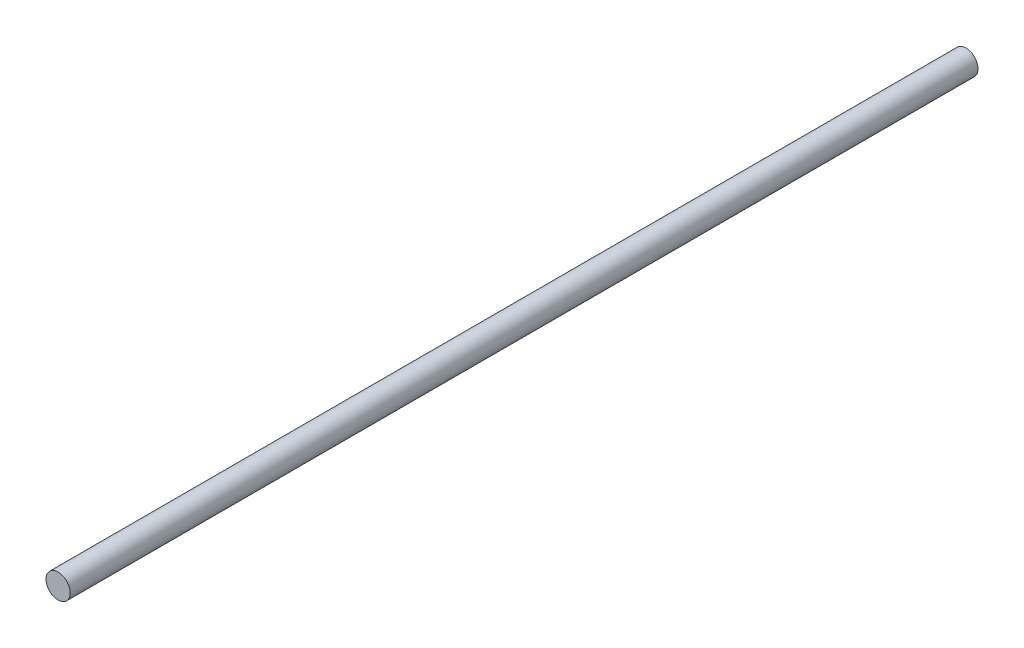
ISO-10303-21;
HEADER;
FILE_DESCRIPTION(('STEP AP214'),'2;1');
FILE_NAME('part.step','',(''),(''),'','','');
FILE_SCHEMA(('AUTOMOTIVE_DESIGN { 1 0 10303 214 1 1 1 1 }'));
ENDSEC;
DATA;
#1=APPLICATION_CONTEXT('core data for automotive mechanical design processes');
#2=APPLICATION_PROTOCOL_DEFINITION('international standard','automotive_design',2000,#1);
#3=PRODUCT_CONTEXT('',#1,'mechanical');
#4=PRODUCT('Part','Part','',(#3));
#5=PRODUCT_RELATED_PRODUCT_CATEGORY('part','',(#4));
#6=PRODUCT_DEFINITION_FORMATION('','',#4);
#7=PRODUCT_DEFINITION_CONTEXT('part definition',#1,'design');
#8=PRODUCT_DEFINITION('design','',#6,#7);
#9=PRODUCT_DEFINITION_SHAPE('','',#8);
#10=(LENGTH_UNIT() NAMED_UNIT(*) SI_UNIT(.MILLI.,.METRE.));
#11=(NAMED_UNIT(*) PLANE_ANGLE_UNIT() SI_UNIT($,.RADIAN.));
#12=(NAMED_UNIT(*) SI_UNIT($,.STERADIAN.) SOLID_ANGLE_UNIT());
#13=UNCERTAINTY_MEASURE_WITH_UNIT(LENGTH_MEASURE(1.E-05),#10,'distance_accuracy_value','');
#14=(GEOMETRIC_REPRESENTATION_CONTEXT(3) GLOBAL_UNCERTAINTY_ASSIGNED_CONTEXT((#13)) GLOBAL_UNIT_ASSIGNED_CONTEXT((#10,
#11,#12)) REPRESENTATION_CONTEXT('',''));
#15=CARTESIAN_POINT('',(0.,0.,0.));
#16=DIRECTION('',(0.,0.,1.));
#17=DIRECTION('',(1.,0.,0.));
#18=AXIS2_PLACEMENT_3D('',#15,#16,#17);
#19=CARTESIAN_POINT('',(0.,0.,600.));
#20=DIRECTION('',(0.,0.,-1.));
#21=DIRECTION('',(-1.,0.,0.));
#22=AXIS2_PLACEMENT_3D('',#19,#20,#21);
#23=CYLINDRICAL_SURFACE('',#22,8.);
#24=CARTESIAN_POINT('',(0.,0.,600.));
#25=DIRECTION('',(0.,0.,1.));
#26=DIRECTION('',(1.,0.,0.));
#27=AXIS2_PLACEMENT_3D('',#24,#25,#26);
#28=CIRCLE('',#27,8.);
#29=CARTESIAN_POINT('',(8.,0.,600.));
#30=VERTEX_POINT('',#29);
#31=EDGE_CURVE('E10',#30,#30,#28,.T.);
#32=ORIENTED_EDGE('',*,*,#31,.F.);
#33=EDGE_LOOP('',(#32));
#34=FACE_BOUND('',#33,.T.);
#35=CARTESIAN_POINT('',(0.,0.,0.));
#36=DIRECTION('',(0.,0.,1.));
#37=DIRECTION('',(1.,0.,0.));
#38=AXIS2_PLACEMENT_3D('',#35,#36,#37);
#39=CIRCLE('',#38,8.);
#40=CARTESIAN_POINT('',(8.,0.,0.));
#41=VERTEX_POINT('',#40);
#42=EDGE_CURVE('E34',#41,#41,#39,.T.);
#43=ORIENTED_EDGE('',*,*,#42,.T.);
#44=EDGE_LOOP('',(#43));
#45=FACE_BOUND('',#44,.T.);
#46=ADVANCED_FACE('F31',(#34,#45),#23,.T.);
#47=CARTESIAN_POINT('',(0.,0.,600.));
#48=DIRECTION('',(0.,0.,1.));
#49=DIRECTION('',(1.,0.,0.));
#50=AXIS2_PLACEMENT_3D('',#47,#48,#49);
#51=PLANE('',#50);
#52=ORIENTED_EDGE('',*,*,#31,.T.);
#53=EDGE_LOOP('',(#52));
#54=FACE_BOUND('',#53,.T.);
#55=ADVANCED_FACE('F46',(#54),#51,.T.);
#56=CARTESIAN_POINT('',(0.,0.,0.));
#57=DIRECTION('',(0.,0.,1.));
#58=DIRECTION('',(1.,0.,0.));
#59=AXIS2_PLACEMENT_3D('',#56,#57,#58);
#60=PLANE('',#59);
#61=ORIENTED_EDGE('',*,*,#42,.F.);
#62=EDGE_LOOP('',(#61));
#63=FACE_BOUND('',#62,.T.);
#64=ADVANCED_FACE('F44',(#63),#60,.F.);
#65=CLOSED_SHELL('',(#46,#55,#64));
#66=MANIFOLD_SOLID_BREP('B2',#65);
#67=ADVANCED_BREP_SHAPE_REPRESENTATION('',(#18,#66),#14);
#68=SHAPE_DEFINITION_REPRESENTATION(#9,#67);
ENDSEC;
END-ISO-10303-21;
